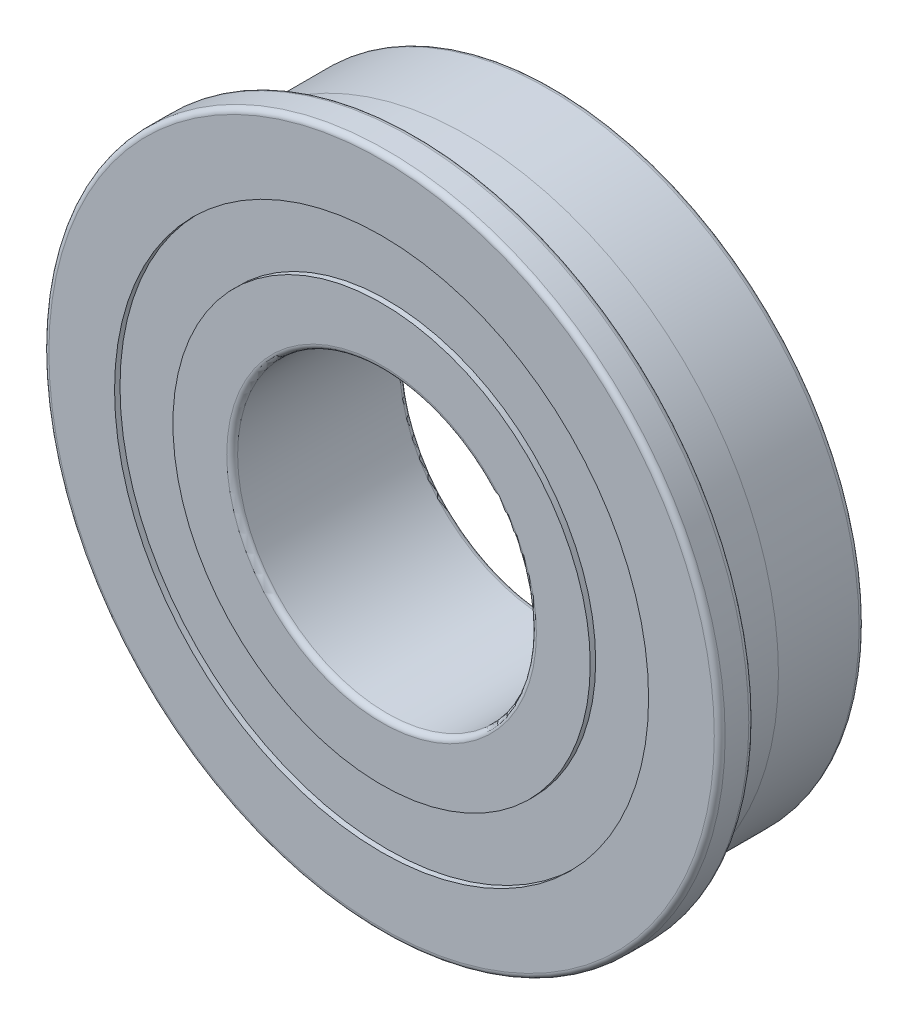
ISO-10303-21;
HEADER;
FILE_DESCRIPTION(('STEP AP214'),'2;1');
FILE_NAME('part.step','',(''),(''),'','','');
FILE_SCHEMA(('AUTOMOTIVE_DESIGN { 1 0 10303 214 1 1 1 1 }'));
ENDSEC;
DATA;
#1=APPLICATION_CONTEXT('core data for automotive mechanical design processes');
#2=APPLICATION_PROTOCOL_DEFINITION('international standard','automotive_design',2000,#1);
#3=PRODUCT_CONTEXT('',#1,'mechanical');
#4=PRODUCT('Part','Part','',(#3));
#5=PRODUCT_RELATED_PRODUCT_CATEGORY('part','',(#4));
#6=PRODUCT_DEFINITION_FORMATION('','',#4);
#7=PRODUCT_DEFINITION_CONTEXT('part definition',#1,'design');
#8=PRODUCT_DEFINITION('design','',#6,#7);
#9=PRODUCT_DEFINITION_SHAPE('','',#8);
#10=(LENGTH_UNIT() NAMED_UNIT(*) SI_UNIT(.MILLI.,.METRE.));
#11=(NAMED_UNIT(*) PLANE_ANGLE_UNIT() SI_UNIT($,.RADIAN.));
#12=(NAMED_UNIT(*) SI_UNIT($,.STERADIAN.) SOLID_ANGLE_UNIT());
#13=UNCERTAINTY_MEASURE_WITH_UNIT(LENGTH_MEASURE(1.E-05),#10,'distance_accuracy_value','');
#14=(GEOMETRIC_REPRESENTATION_CONTEXT(3) GLOBAL_UNCERTAINTY_ASSIGNED_CONTEXT((#13)) GLOBAL_UNIT_ASSIGNED_CONTEXT((#10,
#11,#12)) REPRESENTATION_CONTEXT('',''));
#15=CARTESIAN_POINT('',(0.,0.,0.));
#16=DIRECTION('',(0.,0.,1.));
#17=DIRECTION('',(1.,0.,0.));
#18=AXIS2_PLACEMENT_3D('',#15,#16,#17);
#19=CARTESIAN_POINT('',(0.,0.,53.2489151398073));
#20=DIRECTION('',(0.,0.,1.));
#21=DIRECTION('',(1.,0.,0.));
#22=AXIS2_PLACEMENT_3D('',#19,#20,#21);
#23=CYLINDRICAL_SURFACE('',#22,14.2875);
#24=CARTESIAN_POINT('',(0.,0.,-3.71875));
#25=DIRECTION('',(0.,0.,1.));
#26=DIRECTION('',(1.,0.,0.));
#27=AXIS2_PLACEMENT_3D('',#24,#25,#26);
#28=CIRCLE('',#27,14.2875);
#29=CARTESIAN_POINT('',(14.2875,0.,-3.71875));
#30=VERTEX_POINT('',#29);
#31=EDGE_CURVE('E135',#30,#30,#28,.T.);
#32=ORIENTED_EDGE('',*,*,#31,.T.);
#33=EDGE_LOOP('',(#32));
#34=FACE_BOUND('',#33,.T.);
#35=CARTESIAN_POINT('',(0.,0.,0.));
#36=DIRECTION('',(0.,0.,1.));
#37=DIRECTION('',(1.,0.,0.));
#38=AXIS2_PLACEMENT_3D('',#35,#36,#37);
#39=CIRCLE('',#38,14.2875);
#40=CARTESIAN_POINT('',(14.2875,0.,0.));
#41=VERTEX_POINT('',#40);
#42=EDGE_CURVE('E205',#41,#41,#39,.F.);
#43=ORIENTED_EDGE('',*,*,#42,.T.);
#44=EDGE_LOOP('',(#43));
#45=FACE_BOUND('',#44,.T.);
#46=ADVANCED_FACE('F49',(#34,#45),#23,.T.);
#47=CARTESIAN_POINT('',(0.,0.,53.2489151398073));
#48=DIRECTION('',(0.,0.,1.));
#49=DIRECTION('',(1.,0.,0.));
#50=AXIS2_PLACEMENT_3D('',#47,#48,#49);
#51=CYLINDRICAL_SURFACE('',#50,12.2875);
#52=CARTESIAN_POINT('',(0.,0.,-3.96875));
#53=DIRECTION('',(0.,0.,1.));
#54=DIRECTION('',(1.,0.,0.));
#55=AXIS2_PLACEMENT_3D('',#52,#53,#54);
#56=CIRCLE('',#55,12.2875);
#57=CARTESIAN_POINT('',(12.2875,0.,-3.96875));
#58=VERTEX_POINT('',#57);
#59=EDGE_CURVE('E202',#58,#58,#56,.F.);
#60=ORIENTED_EDGE('',*,*,#59,.T.);
#61=EDGE_LOOP('',(#60));
#62=FACE_BOUND('',#61,.T.);
#63=CARTESIAN_POINT('',(0.,0.,-3.71875));
#64=DIRECTION('',(0.,0.,1.));
#65=DIRECTION('',(1.,0.,0.));
#66=AXIS2_PLACEMENT_3D('',#63,#64,#65);
#67=CIRCLE('',#66,12.2875);
#68=CARTESIAN_POINT('',(12.2875,0.,-3.71875));
#69=VERTEX_POINT('',#68);
#70=EDGE_CURVE('E105',#69,#69,#67,.T.);
#71=ORIENTED_EDGE('',*,*,#70,.T.);
#72=EDGE_LOOP('',(#71));
#73=FACE_BOUND('',#72,.T.);
#74=ADVANCED_FACE('F51',(#62,#73),#51,.F.);
#75=CARTESIAN_POINT('',(0.,12.2875,-3.96875));
#76=DIRECTION('',(0.,0.,1.));
#77=DIRECTION('',(1.,0.,0.));
#78=AXIS2_PLACEMENT_3D('',#75,#76,#77);
#79=PLANE('',#78);
#80=ORIENTED_EDGE('',*,*,#59,.F.);
#81=EDGE_LOOP('',(#80));
#82=FACE_BOUND('',#81,.T.);
#83=CARTESIAN_POINT('',(0.,0.,-3.96875));
#84=DIRECTION('',(0.,0.,1.));
#85=DIRECTION('',(1.,0.,0.));
#86=AXIS2_PLACEMENT_3D('',#83,#84,#85);
#87=CIRCLE('',#86,14.0375);
#88=CARTESIAN_POINT('',(14.0375,0.,-3.96875));
#89=VERTEX_POINT('',#88);
#90=CARTESIAN_POINT('',(-14.0375,0.,-3.96875));
#91=VERTEX_POINT('',#90);
#92=EDGE_CURVE('E95',#89,#91,#87,.T.);
#93=ORIENTED_EDGE('',*,*,#92,.F.);
#94=CARTESIAN_POINT('',(0.,0.,-3.96875));
#95=DIRECTION('',(0.,0.,1.));
#96=DIRECTION('',(-1.,0.,0.));
#97=AXIS2_PLACEMENT_3D('',#94,#95,#96);
#98=CIRCLE('',#97,14.0375);
#99=EDGE_CURVE('E92',#91,#89,#98,.T.);
#100=ORIENTED_EDGE('',*,*,#99,.F.);
#101=EDGE_LOOP('',(#93,#100));
#102=FACE_BOUND('',#101,.T.);
#103=ADVANCED_FACE('F104',(#82,#102),#79,.F.);
#104=CARTESIAN_POINT('',(0.,9.602,-3.71875));
#105=DIRECTION('',(0.,0.,1.));
#106=DIRECTION('',(1.,0.,0.));
#107=AXIS2_PLACEMENT_3D('',#104,#105,#106);
#108=PLANE('',#107);
#109=CARTESIAN_POINT('',(0.,0.,-3.71875));
#110=DIRECTION('',(0.,0.,1.));
#111=DIRECTION('',(1.,0.,0.));
#112=AXIS2_PLACEMENT_3D('',#109,#110,#111);
#113=CIRCLE('',#112,9.602);
#114=CARTESIAN_POINT('',(9.602,0.,-3.71875));
#115=VERTEX_POINT('',#114);
#116=EDGE_CURVE('E100',#115,#115,#113,.F.);
#117=ORIENTED_EDGE('',*,*,#116,.F.);
#118=EDGE_LOOP('',(#117));
#119=FACE_BOUND('',#118,.T.);
#120=ORIENTED_EDGE('',*,*,#70,.F.);
#121=EDGE_LOOP('',(#120));
#122=FACE_BOUND('',#121,.T.);
#123=ADVANCED_FACE('F119',(#119,#122),#108,.F.);
#124=CARTESIAN_POINT('',(0.,0.,-3.71875));
#125=DIRECTION('',(0.,0.,1.));
#126=DIRECTION('',(1.,0.,0.));
#127=AXIS2_PLACEMENT_3D('',#124,#125,#126);
#128=TOROIDAL_SURFACE('',#127,14.0375,0.25);
#129=ORIENTED_EDGE('',*,*,#31,.F.);
#130=EDGE_LOOP('',(#129));
#131=FACE_BOUND('',#130,.T.);
#132=ORIENTED_EDGE('',*,*,#92,.T.);
#133=ORIENTED_EDGE('',*,*,#99,.T.);
#134=EDGE_LOOP('',(#132,#133));
#135=FACE_BOUND('',#134,.T.);
#136=ADVANCED_FACE('F97',(#131,#135),#128,.T.);
#137=CARTESIAN_POINT('',(0.,0.,53.2489151398073));
#138=DIRECTION('',(0.,0.,1.));
#139=DIRECTION('',(1.,0.,0.));
#140=AXIS2_PLACEMENT_3D('',#137,#138,#139);
#141=CYLINDRICAL_SURFACE('',#140,9.602);
#142=ORIENTED_EDGE('',*,*,#116,.T.);
#143=EDGE_LOOP('',(#142));
#144=FACE_BOUND('',#143,.T.);
#145=CARTESIAN_POINT('',(0.,0.,-3.96875));
#146=DIRECTION('',(0.,0.,1.));
#147=DIRECTION('',(1.,0.,0.));
#148=AXIS2_PLACEMENT_3D('',#145,#146,#147);
#149=CIRCLE('',#148,9.602);
#150=CARTESIAN_POINT('',(9.602,0.,-3.96875));
#151=VERTEX_POINT('',#150);
#152=EDGE_CURVE('E138',#151,#151,#149,.T.);
#153=ORIENTED_EDGE('',*,*,#152,.T.);
#154=EDGE_LOOP('',(#153));
#155=FACE_BOUND('',#154,.T.);
#156=ADVANCED_FACE('F129',(#144,#155),#141,.T.);
#157=CARTESIAN_POINT('',(0.,6.875,-3.96875));
#158=DIRECTION('',(0.,0.,1.));
#159=DIRECTION('',(1.,0.,0.));
#160=AXIS2_PLACEMENT_3D('',#157,#158,#159);
#161=PLANE('',#160);
#162=ORIENTED_EDGE('',*,*,#152,.F.);
#163=EDGE_LOOP('',(#162));
#164=FACE_BOUND('',#163,.T.);
#165=CARTESIAN_POINT('',(0.,0.,-3.96875));
#166=DIRECTION('',(0.,0.,-1.));
#167=DIRECTION('',(1.,0.,0.));
#168=AXIS2_PLACEMENT_3D('',#165,#166,#167);
#169=CIRCLE('',#168,7.125);
#170=CARTESIAN_POINT('',(7.125,0.,-3.96875));
#171=VERTEX_POINT('',#170);
#172=CARTESIAN_POINT('',(-7.125,0.,-3.96875));
#173=VERTEX_POINT('',#172);
#174=EDGE_CURVE('E170',#171,#173,#169,.T.);
#175=ORIENTED_EDGE('',*,*,#174,.F.);
#176=CARTESIAN_POINT('',(0.,0.,-3.96875));
#177=DIRECTION('',(0.,0.,-1.));
#178=DIRECTION('',(-1.,0.,0.));
#179=AXIS2_PLACEMENT_3D('',#176,#177,#178);
#180=CIRCLE('',#179,7.125);
#181=EDGE_CURVE('E179',#173,#171,#180,.T.);
#182=ORIENTED_EDGE('',*,*,#181,.F.);
#183=EDGE_LOOP('',(#175,#182));
#184=FACE_BOUND('',#183,.T.);
#185=ADVANCED_FACE('F156',(#164,#184),#161,.F.);
#186=CARTESIAN_POINT('',(0.,0.,-3.71875));
#187=DIRECTION('',(0.,0.,1.));
#188=DIRECTION('',(1.,0.,0.));
#189=AXIS2_PLACEMENT_3D('',#186,#187,#188);
#190=TOROIDAL_SURFACE('',#189,7.125,0.25);
#191=ORIENTED_EDGE('',*,*,#174,.T.);
#192=ORIENTED_EDGE('',*,*,#181,.T.);
#193=EDGE_LOOP('',(#191,#192));
#194=FACE_BOUND('',#193,.T.);
#195=CARTESIAN_POINT('',(0.,0.,-3.71875));
#196=DIRECTION('',(0.,0.,1.));
#197=DIRECTION('',(1.,0.,0.));
#198=AXIS2_PLACEMENT_3D('',#195,#196,#197);
#199=CIRCLE('',#198,6.875);
#200=CARTESIAN_POINT('',(6.875,0.,-3.71875));
#201=VERTEX_POINT('',#200);
#202=EDGE_CURVE('E164',#201,#201,#199,.T.);
#203=ORIENTED_EDGE('',*,*,#202,.T.);
#204=EDGE_LOOP('',(#203));
#205=FACE_BOUND('',#204,.T.);
#206=ADVANCED_FACE('F144',(#194,#205),#190,.T.);
#207=CARTESIAN_POINT('',(0.,0.,53.2489151398073));
#208=DIRECTION('',(0.,0.,1.));
#209=DIRECTION('',(1.,0.,0.));
#210=AXIS2_PLACEMENT_3D('',#207,#208,#209);
#211=CYLINDRICAL_SURFACE('',#210,6.875);
#212=CARTESIAN_POINT('',(0.,0.,3.71875));
#213=DIRECTION('',(0.,0.,-1.));
#214=DIRECTION('',(-1.,0.,0.));
#215=AXIS2_PLACEMENT_3D('',#212,#213,#214);
#216=CIRCLE('',#215,6.875);
#217=CARTESIAN_POINT('',(-6.875,0.,3.71875));
#218=VERTEX_POINT('',#217);
#219=EDGE_CURVE('E188',#218,#218,#216,.T.);
#220=ORIENTED_EDGE('',*,*,#219,.F.);
#221=EDGE_LOOP('',(#220));
#222=FACE_BOUND('',#221,.T.);
#223=ORIENTED_EDGE('',*,*,#202,.F.);
#224=EDGE_LOOP('',(#223));
#225=FACE_BOUND('',#224,.T.);
#226=ADVANCED_FACE('F155',(#222,#225),#211,.F.);
#227=CARTESIAN_POINT('',(0.,0.,3.71875));
#228=DIRECTION('',(0.,0.,-1.));
#229=DIRECTION('',(-1.,0.,0.));
#230=AXIS2_PLACEMENT_3D('',#227,#228,#229);
#231=TOROIDAL_SURFACE('',#230,7.125,0.25);
#232=CARTESIAN_POINT('',(0.,0.,3.96875));
#233=DIRECTION('',(0.,0.,1.));
#234=DIRECTION('',(-1.,0.,0.));
#235=AXIS2_PLACEMENT_3D('',#232,#233,#234);
#236=CIRCLE('',#235,7.125);
#237=CARTESIAN_POINT('',(-7.125,0.,3.96875));
#238=VERTEX_POINT('',#237);
#239=CARTESIAN_POINT('',(7.125,0.,3.96875));
#240=VERTEX_POINT('',#239);
#241=EDGE_CURVE('E284',#238,#240,#236,.T.);
#242=ORIENTED_EDGE('',*,*,#241,.T.);
#243=CARTESIAN_POINT('',(0.,0.,3.96875));
#244=DIRECTION('',(0.,0.,1.));
#245=DIRECTION('',(1.,0.,0.));
#246=AXIS2_PLACEMENT_3D('',#243,#244,#245);
#247=CIRCLE('',#246,7.125);
#248=EDGE_CURVE('E302',#240,#238,#247,.T.);
#249=ORIENTED_EDGE('',*,*,#248,.T.);
#250=EDGE_LOOP('',(#242,#249));
#251=FACE_BOUND('',#250,.T.);
#252=ORIENTED_EDGE('',*,*,#219,.T.);
#253=EDGE_LOOP('',(#252));
#254=FACE_BOUND('',#253,.T.);
#255=ADVANCED_FACE('F288',(#251,#254),#231,.T.);
#256=CARTESIAN_POINT('',(0.,14.2875,2.38125));
#257=DIRECTION('',(0.,0.,1.));
#258=DIRECTION('',(1.,0.,0.));
#259=AXIS2_PLACEMENT_3D('',#256,#257,#258);
#260=PLANE('',#259);
#261=CARTESIAN_POINT('',(0.,0.,2.38125));
#262=DIRECTION('',(0.,0.,1.));
#263=DIRECTION('',(1.,0.,0.));
#264=AXIS2_PLACEMENT_3D('',#261,#262,#263);
#265=CIRCLE('',#264,14.29385);
#266=CARTESIAN_POINT('',(14.29385,0.,2.38125));
#267=VERTEX_POINT('',#266);
#268=EDGE_CURVE('E11',#267,#267,#265,.F.);
#269=ORIENTED_EDGE('',*,*,#268,.F.);
#270=EDGE_LOOP('',(#269));
#271=FACE_BOUND('',#270,.T.);
#272=CARTESIAN_POINT('',(0.,0.,2.38125));
#273=DIRECTION('',(0.,0.,1.));
#274=DIRECTION('',(1.,0.,0.));
#275=AXIS2_PLACEMENT_3D('',#272,#273,#274);
#276=CIRCLE('',#275,15.31);
#277=CARTESIAN_POINT('',(15.31,0.,2.38125));
#278=VERTEX_POINT('',#277);
#279=CARTESIAN_POINT('',(-15.31,0.,2.38125));
#280=VERTEX_POINT('',#279);
#281=EDGE_CURVE('E313',#278,#280,#276,.T.);
#282=ORIENTED_EDGE('',*,*,#281,.F.);
#283=CARTESIAN_POINT('',(0.,0.,2.38125));
#284=DIRECTION('',(0.,0.,1.));
#285=DIRECTION('',(-1.,0.,0.));
#286=AXIS2_PLACEMENT_3D('',#283,#284,#285);
#287=CIRCLE('',#286,15.31);
#288=EDGE_CURVE('E314',#280,#278,#287,.T.);
#289=ORIENTED_EDGE('',*,*,#288,.F.);
#290=EDGE_LOOP('',(#282,#289));
#291=FACE_BOUND('',#290,.T.);
#292=ADVANCED_FACE('F296',(#271,#291),#260,.F.);
#293=CARTESIAN_POINT('',(0.,9.602,3.96875));
#294=DIRECTION('',(0.,0.,-1.));
#295=DIRECTION('',(-1.,0.,0.));
#296=AXIS2_PLACEMENT_3D('',#293,#294,#295);
#297=PLANE('',#296);
#298=CARTESIAN_POINT('',(0.,0.,3.96875));
#299=DIRECTION('',(0.,0.,1.));
#300=DIRECTION('',(1.,0.,0.));
#301=AXIS2_PLACEMENT_3D('',#298,#299,#300);
#302=CIRCLE('',#301,9.602);
#303=CARTESIAN_POINT('',(9.602,0.,3.96875));
#304=VERTEX_POINT('',#303);
#305=EDGE_CURVE('E196',#304,#304,#302,.F.);
#306=ORIENTED_EDGE('',*,*,#305,.F.);
#307=EDGE_LOOP('',(#306));
#308=FACE_BOUND('',#307,.T.);
#309=ORIENTED_EDGE('',*,*,#241,.F.);
#310=ORIENTED_EDGE('',*,*,#248,.F.);
#311=EDGE_LOOP('',(#309,#310));
#312=FACE_BOUND('',#311,.T.);
#313=ADVANCED_FACE('F262',(#308,#312),#297,.F.);
#314=CARTESIAN_POINT('',(0.,0.,2.63125));
#315=DIRECTION('',(0.,0.,1.));
#316=DIRECTION('',(1.,0.,0.));
#317=AXIS2_PLACEMENT_3D('',#314,#315,#316);
#318=TOROIDAL_SURFACE('',#317,15.31,0.25);
#319=ORIENTED_EDGE('',*,*,#281,.T.);
#320=ORIENTED_EDGE('',*,*,#288,.T.);
#321=EDGE_LOOP('',(#319,#320));
#322=FACE_BOUND('',#321,.T.);
#323=CARTESIAN_POINT('',(0.,0.,2.63125));
#324=DIRECTION('',(0.,0.,1.));
#325=DIRECTION('',(1.,0.,0.));
#326=AXIS2_PLACEMENT_3D('',#323,#324,#325);
#327=CIRCLE('',#326,15.56);
#328=CARTESIAN_POINT('',(15.56,0.,2.63125));
#329=VERTEX_POINT('',#328);
#330=EDGE_CURVE('E249',#329,#329,#327,.T.);
#331=ORIENTED_EDGE('',*,*,#330,.F.);
#332=EDGE_LOOP('',(#331));
#333=FACE_BOUND('',#332,.T.);
#334=ADVANCED_FACE('F256',(#322,#333),#318,.T.);
#335=CARTESIAN_POINT('',(0.,0.,53.2489151398073));
#336=DIRECTION('',(0.,0.,1.));
#337=DIRECTION('',(1.,0.,0.));
#338=AXIS2_PLACEMENT_3D('',#335,#336,#337);
#339=CYLINDRICAL_SURFACE('',#338,9.602);
#340=ORIENTED_EDGE('',*,*,#305,.T.);
#341=EDGE_LOOP('',(#340));
#342=FACE_BOUND('',#341,.T.);
#343=CARTESIAN_POINT('',(0.,0.,3.71875));
#344=DIRECTION('',(0.,0.,1.));
#345=DIRECTION('',(1.,0.,0.));
#346=AXIS2_PLACEMENT_3D('',#343,#344,#345);
#347=CIRCLE('',#346,9.602);
#348=CARTESIAN_POINT('',(9.602,0.,3.71875));
#349=VERTEX_POINT('',#348);
#350=EDGE_CURVE('E248',#349,#349,#347,.T.);
#351=ORIENTED_EDGE('',*,*,#350,.T.);
#352=EDGE_LOOP('',(#351));
#353=FACE_BOUND('',#352,.T.);
#354=ADVANCED_FACE('F261',(#342,#353),#339,.T.);
#355=CARTESIAN_POINT('',(0.,0.,53.2489151398073));
#356=DIRECTION('',(0.,0.,1.));
#357=DIRECTION('',(1.,0.,0.));
#358=AXIS2_PLACEMENT_3D('',#355,#356,#357);
#359=CYLINDRICAL_SURFACE('',#358,15.56);
#360=ORIENTED_EDGE('',*,*,#330,.T.);
#361=EDGE_LOOP('',(#360));
#362=FACE_BOUND('',#361,.T.);
#363=CARTESIAN_POINT('',(0.,0.,3.71875));
#364=DIRECTION('',(0.,0.,-1.));
#365=DIRECTION('',(-1.,0.,0.));
#366=AXIS2_PLACEMENT_3D('',#363,#364,#365);
#367=CIRCLE('',#366,15.56);
#368=CARTESIAN_POINT('',(-15.56,0.,3.71875));
#369=VERTEX_POINT('',#368);
#370=EDGE_CURVE('E239',#369,#369,#367,.F.);
#371=ORIENTED_EDGE('',*,*,#370,.F.);
#372=EDGE_LOOP('',(#371));
#373=FACE_BOUND('',#372,.T.);
#374=ADVANCED_FACE('F422',(#362,#373),#359,.T.);
#375=CARTESIAN_POINT('',(0.,12.2875,3.71875));
#376=DIRECTION('',(0.,0.,-1.));
#377=DIRECTION('',(-1.,0.,0.));
#378=AXIS2_PLACEMENT_3D('',#375,#376,#377);
#379=PLANE('',#378);
#380=CARTESIAN_POINT('',(0.,0.,3.71875));
#381=DIRECTION('',(0.,0.,1.));
#382=DIRECTION('',(1.,0.,0.));
#383=AXIS2_PLACEMENT_3D('',#380,#381,#382);
#384=CIRCLE('',#383,12.2875);
#385=CARTESIAN_POINT('',(12.2875,0.,3.71875));
#386=VERTEX_POINT('',#385);
#387=EDGE_CURVE('E247',#386,#386,#384,.T.);
#388=ORIENTED_EDGE('',*,*,#387,.T.);
#389=EDGE_LOOP('',(#388));
#390=FACE_BOUND('',#389,.T.);
#391=ORIENTED_EDGE('',*,*,#350,.F.);
#392=EDGE_LOOP('',(#391));
#393=FACE_BOUND('',#392,.T.);
#394=ADVANCED_FACE('F226',(#390,#393),#379,.F.);
#395=CARTESIAN_POINT('',(0.,0.,3.71875));
#396=DIRECTION('',(0.,0.,-1.));
#397=DIRECTION('',(-1.,0.,0.));
#398=AXIS2_PLACEMENT_3D('',#395,#396,#397);
#399=TOROIDAL_SURFACE('',#398,15.31,0.25);
#400=CARTESIAN_POINT('',(0.,0.,3.96875));
#401=DIRECTION('',(0.,0.,-1.));
#402=DIRECTION('',(-1.,0.,0.));
#403=AXIS2_PLACEMENT_3D('',#400,#401,#402);
#404=CIRCLE('',#403,15.31);
#405=CARTESIAN_POINT('',(-15.31,0.,3.96875));
#406=VERTEX_POINT('',#405);
#407=CARTESIAN_POINT('',(15.31,0.,3.96875));
#408=VERTEX_POINT('',#407);
#409=EDGE_CURVE('E208',#406,#408,#404,.T.);
#410=ORIENTED_EDGE('',*,*,#409,.T.);
#411=CARTESIAN_POINT('',(0.,0.,3.96875));
#412=DIRECTION('',(0.,0.,-1.));
#413=DIRECTION('',(1.,0.,0.));
#414=AXIS2_PLACEMENT_3D('',#411,#412,#413);
#415=CIRCLE('',#414,15.31);
#416=EDGE_CURVE('E65',#408,#406,#415,.T.);
#417=ORIENTED_EDGE('',*,*,#416,.T.);
#418=EDGE_LOOP('',(#410,#417));
#419=FACE_BOUND('',#418,.T.);
#420=ORIENTED_EDGE('',*,*,#370,.T.);
#421=EDGE_LOOP('',(#420));
#422=FACE_BOUND('',#421,.T.);
#423=ADVANCED_FACE('F214',(#419,#422),#399,.T.);
#424=CARTESIAN_POINT('',(0.,0.,53.2489151398073));
#425=DIRECTION('',(0.,0.,1.));
#426=DIRECTION('',(1.,0.,0.));
#427=AXIS2_PLACEMENT_3D('',#424,#425,#426);
#428=CYLINDRICAL_SURFACE('',#427,12.2875);
#429=ORIENTED_EDGE('',*,*,#387,.F.);
#430=EDGE_LOOP('',(#429));
#431=FACE_BOUND('',#430,.T.);
#432=CARTESIAN_POINT('',(0.,0.,3.96875));
#433=DIRECTION('',(0.,0.,1.));
#434=DIRECTION('',(1.,0.,0.));
#435=AXIS2_PLACEMENT_3D('',#432,#433,#434);
#436=CIRCLE('',#435,12.2875);
#437=CARTESIAN_POINT('',(12.2875,0.,3.96875));
#438=VERTEX_POINT('',#437);
#439=EDGE_CURVE('E58',#438,#438,#436,.T.);
#440=ORIENTED_EDGE('',*,*,#439,.T.);
#441=EDGE_LOOP('',(#440));
#442=FACE_BOUND('',#441,.T.);
#443=ADVANCED_FACE('F225',(#431,#442),#428,.F.);
#444=CARTESIAN_POINT('',(0.,15.56,3.96875));
#445=DIRECTION('',(0.,0.,-1.));
#446=DIRECTION('',(-1.,0.,0.));
#447=AXIS2_PLACEMENT_3D('',#444,#445,#446);
#448=PLANE('',#447);
#449=ORIENTED_EDGE('',*,*,#439,.F.);
#450=EDGE_LOOP('',(#449));
#451=FACE_BOUND('',#450,.T.);
#452=ORIENTED_EDGE('',*,*,#409,.F.);
#453=ORIENTED_EDGE('',*,*,#416,.F.);
#454=EDGE_LOOP('',(#452,#453));
#455=FACE_BOUND('',#454,.T.);
#456=ADVANCED_FACE('F363',(#451,#455),#448,.F.);
#457=CARTESIAN_POINT('',(0.,0.,42.8103630570533));
#458=DIRECTION('',(0.,0.,-1.));
#459=DIRECTION('',(-1.,0.,0.));
#460=AXIS2_PLACEMENT_3D('',#457,#458,#459);
#461=CYLINDRICAL_SURFACE('',#460,14.29385);
#462=CARTESIAN_POINT('',(0.,0.,0.));
#463=DIRECTION('',(0.,0.,1.));
#464=DIRECTION('',(1.,0.,0.));
#465=AXIS2_PLACEMENT_3D('',#462,#463,#464);
#466=CIRCLE('',#465,14.29385);
#467=CARTESIAN_POINT('',(14.29385,0.,0.));
#468=VERTEX_POINT('',#467);
#469=EDGE_CURVE('E398',#468,#468,#466,.T.);
#470=ORIENTED_EDGE('',*,*,#469,.T.);
#471=EDGE_LOOP('',(#470));
#472=FACE_BOUND('',#471,.T.);
#473=ORIENTED_EDGE('',*,*,#268,.T.);
#474=EDGE_LOOP('',(#473));
#475=FACE_BOUND('',#474,.T.);
#476=ADVANCED_FACE('F369',(#472,#475),#461,.T.);
#477=CARTESIAN_POINT('',(0.,0.,0.));
#478=DIRECTION('',(0.,0.,1.));
#479=DIRECTION('',(1.,0.,0.));
#480=AXIS2_PLACEMENT_3D('',#477,#478,#479);
#481=PLANE('',#480);
#482=ORIENTED_EDGE('',*,*,#42,.F.);
#483=EDGE_LOOP('',(#482));
#484=FACE_BOUND('',#483,.T.);
#485=ORIENTED_EDGE('',*,*,#469,.F.);
#486=EDGE_LOOP('',(#485));
#487=FACE_BOUND('',#486,.T.);
#488=ADVANCED_FACE('F378',(#484,#487),#481,.F.);
#489=CLOSED_SHELL('',(#46,#74,#103,#123,#136,#156,#185,#206,#226,#255,#292,#313,#334,#354,#374,
#394,#423,#443,#456,#476,#488));
#490=MANIFOLD_SOLID_BREP('B2',#489);
#491=ADVANCED_BREP_SHAPE_REPRESENTATION('',(#18,#490),#14);
#492=SHAPE_DEFINITION_REPRESENTATION(#9,#491);
ENDSEC;
END-ISO-10303-21;
